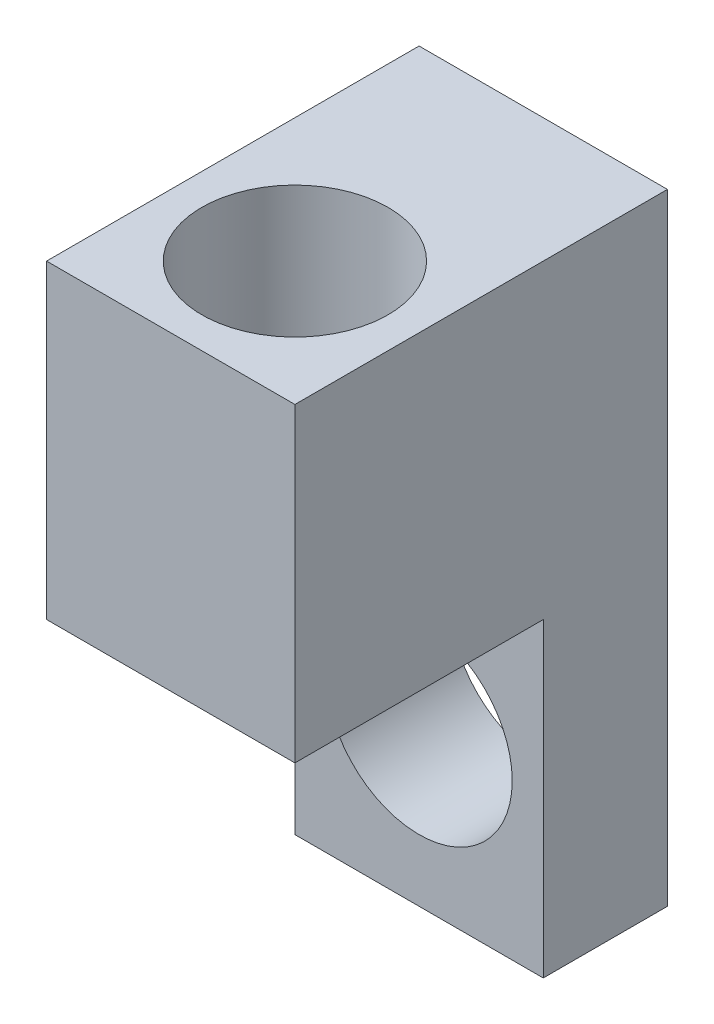
ISO-10303-21;
HEADER;
FILE_DESCRIPTION(('STEP AP214'),'2;1');
FILE_NAME('part.step','',(''),(''),'','','');
FILE_SCHEMA(('AUTOMOTIVE_DESIGN { 1 0 10303 214 1 1 1 1 }'));
ENDSEC;
DATA;
#1=APPLICATION_CONTEXT('core data for automotive mechanical design processes');
#2=APPLICATION_PROTOCOL_DEFINITION('international standard','automotive_design',2000,#1);
#3=PRODUCT_CONTEXT('',#1,'mechanical');
#4=PRODUCT('Part','Part','',(#3));
#5=PRODUCT_RELATED_PRODUCT_CATEGORY('part','',(#4));
#6=PRODUCT_DEFINITION_FORMATION('','',#4);
#7=PRODUCT_DEFINITION_CONTEXT('part definition',#1,'design');
#8=PRODUCT_DEFINITION('design','',#6,#7);
#9=PRODUCT_DEFINITION_SHAPE('','',#8);
#10=(LENGTH_UNIT() NAMED_UNIT(*) SI_UNIT(.MILLI.,.METRE.));
#11=(NAMED_UNIT(*) PLANE_ANGLE_UNIT() SI_UNIT($,.RADIAN.));
#12=(NAMED_UNIT(*) SI_UNIT($,.STERADIAN.) SOLID_ANGLE_UNIT());
#13=UNCERTAINTY_MEASURE_WITH_UNIT(LENGTH_MEASURE(1.E-05),#10,'distance_accuracy_value','');
#14=(GEOMETRIC_REPRESENTATION_CONTEXT(3) GLOBAL_UNCERTAINTY_ASSIGNED_CONTEXT((#13)) GLOBAL_UNIT_ASSIGNED_CONTEXT((#10,
#11,#12)) REPRESENTATION_CONTEXT('',''));
#15=CARTESIAN_POINT('',(0.,0.,0.));
#16=DIRECTION('',(0.,0.,1.));
#17=DIRECTION('',(1.,0.,0.));
#18=AXIS2_PLACEMENT_3D('',#15,#16,#17);
#19=CARTESIAN_POINT('',(4.,-10.,12.));
#20=DIRECTION('',(-1.,0.,0.));
#21=DIRECTION('',(0.,0.,1.));
#22=AXIS2_PLACEMENT_3D('',#19,#20,#21);
#23=PLANE('',#22);
#24=DIRECTION('',(0.,0.,1.));
#25=VECTOR('',#24,1.);
#26=CARTESIAN_POINT('',(4.,0.,12.));
#27=LINE('',#26,#25);
#28=CARTESIAN_POINT('',(4.,0.,4.));
#29=VERTEX_POINT('',#28);
#30=CARTESIAN_POINT('',(4.,0.,12.));
#31=VERTEX_POINT('',#30);
#32=EDGE_CURVE('E47',#29,#31,#27,.T.);
#33=ORIENTED_EDGE('',*,*,#32,.F.);
#34=DIRECTION('',(0.,1.,0.));
#35=VECTOR('',#34,1.);
#36=CARTESIAN_POINT('',(4.,-10.,4.));
#37=LINE('',#36,#35);
#38=CARTESIAN_POINT('',(4.,-10.,4.));
#39=VERTEX_POINT('',#38);
#40=EDGE_CURVE('E82',#39,#29,#37,.T.);
#41=ORIENTED_EDGE('',*,*,#40,.F.);
#42=DIRECTION('',(0.,0.,-1.));
#43=VECTOR('',#42,1.);
#44=CARTESIAN_POINT('',(4.,-10.,12.));
#45=LINE('',#44,#43);
#46=CARTESIAN_POINT('',(4.,-10.,0.));
#47=VERTEX_POINT('',#46);
#48=EDGE_CURVE('E76',#39,#47,#45,.T.);
#49=ORIENTED_EDGE('',*,*,#48,.T.);
#50=DIRECTION('',(0.,1.,0.));
#51=VECTOR('',#50,1.);
#52=CARTESIAN_POINT('',(4.,-10.,0.));
#53=LINE('',#52,#51);
#54=CARTESIAN_POINT('',(4.,10.,0.));
#55=VERTEX_POINT('',#54);
#56=EDGE_CURVE('E80',#47,#55,#53,.T.);
#57=ORIENTED_EDGE('',*,*,#56,.T.);
#58=DIRECTION('',(0.,0.,-1.));
#59=VECTOR('',#58,1.);
#60=CARTESIAN_POINT('',(4.,10.,12.));
#61=LINE('',#60,#59);
#62=CARTESIAN_POINT('',(4.,10.,12.));
#63=VERTEX_POINT('',#62);
#64=EDGE_CURVE('E11',#63,#55,#61,.T.);
#65=ORIENTED_EDGE('',*,*,#64,.F.);
#66=DIRECTION('',(0.,1.,0.));
#67=VECTOR('',#66,1.);
#68=CARTESIAN_POINT('',(4.,-10.,12.));
#69=LINE('',#68,#67);
#70=EDGE_CURVE('E95',#31,#63,#69,.T.);
#71=ORIENTED_EDGE('',*,*,#70,.F.);
#72=EDGE_LOOP('',(#33,#41,#49,#57,#65,#71));
#73=FACE_BOUND('',#72,.T.);
#74=ADVANCED_FACE('F33',(#73),#23,.F.);
#75=CARTESIAN_POINT('',(-4.,10.,12.));
#76=DIRECTION('',(0.,-1.,0.));
#77=DIRECTION('',(0.,0.,-1.));
#78=AXIS2_PLACEMENT_3D('',#75,#76,#77);
#79=PLANE('',#78);
#80=CARTESIAN_POINT('',(0.,10.,8.));
#81=DIRECTION('',(0.,-1.,0.));
#82=DIRECTION('',(0.,0.,-1.));
#83=AXIS2_PLACEMENT_3D('',#80,#81,#82);
#84=CIRCLE('',#83,3.);
#85=CARTESIAN_POINT('',(0.,10.,5.));
#86=VERTEX_POINT('',#85);
#87=EDGE_CURVE('E131',#86,#86,#84,.F.);
#88=ORIENTED_EDGE('',*,*,#87,.F.);
#89=EDGE_LOOP('',(#88));
#90=FACE_BOUND('',#89,.T.);
#91=DIRECTION('',(-1.,0.,0.));
#92=VECTOR('',#91,1.);
#93=CARTESIAN_POINT('',(-4.,10.,0.));
#94=LINE('',#93,#92);
#95=CARTESIAN_POINT('',(-4.,10.,0.));
#96=VERTEX_POINT('',#95);
#97=EDGE_CURVE('E99',#55,#96,#94,.T.);
#98=ORIENTED_EDGE('',*,*,#97,.T.);
#99=DIRECTION('',(0.,0.,-1.));
#100=VECTOR('',#99,1.);
#101=CARTESIAN_POINT('',(-4.,10.,12.));
#102=LINE('',#101,#100);
#103=CARTESIAN_POINT('',(-4.,10.,12.));
#104=VERTEX_POINT('',#103);
#105=EDGE_CURVE('E40',#104,#96,#102,.T.);
#106=ORIENTED_EDGE('',*,*,#105,.F.);
#107=DIRECTION('',(-1.,0.,0.));
#108=VECTOR('',#107,1.);
#109=CARTESIAN_POINT('',(-4.,10.,12.));
#110=LINE('',#109,#108);
#111=EDGE_CURVE('E56',#63,#104,#110,.T.);
#112=ORIENTED_EDGE('',*,*,#111,.F.);
#113=ORIENTED_EDGE('',*,*,#64,.T.);
#114=EDGE_LOOP('',(#98,#106,#112,#113));
#115=FACE_BOUND('',#114,.T.);
#116=ADVANCED_FACE('F113',(#90,#115),#79,.F.);
#117=CARTESIAN_POINT('',(-4.,-10.,12.));
#118=DIRECTION('',(1.,0.,0.));
#119=DIRECTION('',(0.,0.,-1.));
#120=AXIS2_PLACEMENT_3D('',#117,#118,#119);
#121=PLANE('',#120);
#122=DIRECTION('',(0.,0.,-1.));
#123=VECTOR('',#122,1.);
#124=CARTESIAN_POINT('',(-4.,-10.,12.));
#125=LINE('',#124,#123);
#126=CARTESIAN_POINT('',(-4.,-10.,4.));
#127=VERTEX_POINT('',#126);
#128=CARTESIAN_POINT('',(-4.,-10.,0.));
#129=VERTEX_POINT('',#128);
#130=EDGE_CURVE('E85',#127,#129,#125,.T.);
#131=ORIENTED_EDGE('',*,*,#130,.F.);
#132=DIRECTION('',(0.,-1.,0.));
#133=VECTOR('',#132,1.);
#134=CARTESIAN_POINT('',(-4.,-10.,4.));
#135=LINE('',#134,#133);
#136=CARTESIAN_POINT('',(-4.,0.,4.));
#137=VERTEX_POINT('',#136);
#138=EDGE_CURVE('E121',#137,#127,#135,.T.);
#139=ORIENTED_EDGE('',*,*,#138,.F.);
#140=DIRECTION('',(0.,0.,-1.));
#141=VECTOR('',#140,1.);
#142=CARTESIAN_POINT('',(-4.,0.,12.));
#143=LINE('',#142,#141);
#144=CARTESIAN_POINT('',(-4.,0.,12.));
#145=VERTEX_POINT('',#144);
#146=EDGE_CURVE('E128',#145,#137,#143,.T.);
#147=ORIENTED_EDGE('',*,*,#146,.F.);
#148=DIRECTION('',(0.,-1.,0.));
#149=VECTOR('',#148,1.);
#150=CARTESIAN_POINT('',(-4.,-10.,12.));
#151=LINE('',#150,#149);
#152=EDGE_CURVE('E86',#104,#145,#151,.T.);
#153=ORIENTED_EDGE('',*,*,#152,.F.);
#154=ORIENTED_EDGE('',*,*,#105,.T.);
#155=DIRECTION('',(0.,-1.,0.));
#156=VECTOR('',#155,1.);
#157=CARTESIAN_POINT('',(-4.,-10.,0.));
#158=LINE('',#157,#156);
#159=EDGE_CURVE('E96',#96,#129,#158,.T.);
#160=ORIENTED_EDGE('',*,*,#159,.T.);
#161=EDGE_LOOP('',(#131,#139,#147,#153,#154,#160));
#162=FACE_BOUND('',#161,.T.);
#163=ADVANCED_FACE('F110',(#162),#121,.F.);
#164=CARTESIAN_POINT('',(-4.,-10.,12.));
#165=DIRECTION('',(0.,1.,0.));
#166=DIRECTION('',(0.,0.,1.));
#167=AXIS2_PLACEMENT_3D('',#164,#165,#166);
#168=PLANE('',#167);
#169=ORIENTED_EDGE('',*,*,#48,.F.);
#170=DIRECTION('',(-1.,0.,0.));
#171=VECTOR('',#170,1.);
#172=CARTESIAN_POINT('',(16.8062484748657,-10.,4.));
#173=LINE('',#172,#171);
#174=EDGE_CURVE('E124',#39,#127,#173,.T.);
#175=ORIENTED_EDGE('',*,*,#174,.T.);
#176=ORIENTED_EDGE('',*,*,#130,.T.);
#177=DIRECTION('',(1.,0.,0.));
#178=VECTOR('',#177,1.);
#179=CARTESIAN_POINT('',(-4.,-10.,0.));
#180=LINE('',#179,#178);
#181=EDGE_CURVE('E89',#129,#47,#180,.T.);
#182=ORIENTED_EDGE('',*,*,#181,.T.);
#183=EDGE_LOOP('',(#169,#175,#176,#182));
#184=FACE_BOUND('',#183,.T.);
#185=ADVANCED_FACE('F90',(#184),#168,.F.);
#186=CARTESIAN_POINT('',(0.,0.,12.));
#187=DIRECTION('',(0.,0.,-1.));
#188=DIRECTION('',(-1.,0.,0.));
#189=AXIS2_PLACEMENT_3D('',#186,#187,#188);
#190=PLANE('',#189);
#191=ORIENTED_EDGE('',*,*,#152,.T.);
#192=DIRECTION('',(-1.,0.,0.));
#193=VECTOR('',#192,1.);
#194=CARTESIAN_POINT('',(16.8062484748657,0.,12.));
#195=LINE('',#194,#193);
#196=EDGE_CURVE('E118',#31,#145,#195,.T.);
#197=ORIENTED_EDGE('',*,*,#196,.F.);
#198=ORIENTED_EDGE('',*,*,#70,.T.);
#199=ORIENTED_EDGE('',*,*,#111,.T.);
#200=EDGE_LOOP('',(#191,#197,#198,#199));
#201=FACE_BOUND('',#200,.T.);
#202=ADVANCED_FACE('F162',(#201),#190,.F.);
#203=CARTESIAN_POINT('',(0.,0.,0.));
#204=DIRECTION('',(0.,0.,-1.));
#205=DIRECTION('',(-1.,0.,0.));
#206=AXIS2_PLACEMENT_3D('',#203,#204,#205);
#207=PLANE('',#206);
#208=CARTESIAN_POINT('',(0.,-5.,0.));
#209=DIRECTION('',(0.,0.,-1.));
#210=DIRECTION('',(-1.,0.,0.));
#211=AXIS2_PLACEMENT_3D('',#208,#209,#210);
#212=CIRCLE('',#211,3.);
#213=CARTESIAN_POINT('',(-3.,-5.,0.));
#214=VERTEX_POINT('',#213);
#215=EDGE_CURVE('E138',#214,#214,#212,.F.);
#216=ORIENTED_EDGE('',*,*,#215,.T.);
#217=EDGE_LOOP('',(#216));
#218=FACE_BOUND('',#217,.T.);
#219=ORIENTED_EDGE('',*,*,#56,.F.);
#220=ORIENTED_EDGE('',*,*,#181,.F.);
#221=ORIENTED_EDGE('',*,*,#159,.F.);
#222=ORIENTED_EDGE('',*,*,#97,.F.);
#223=EDGE_LOOP('',(#219,#220,#221,#222));
#224=FACE_BOUND('',#223,.T.);
#225=ADVANCED_FACE('F98',(#218,#224),#207,.T.);
#226=CARTESIAN_POINT('',(16.8062484748657,-10.,4.));
#227=DIRECTION('',(0.,0.,-1.));
#228=DIRECTION('',(-1.,0.,0.));
#229=AXIS2_PLACEMENT_3D('',#226,#227,#228);
#230=PLANE('',#229);
#231=CARTESIAN_POINT('',(0.,-5.,4.));
#232=DIRECTION('',(0.,0.,1.));
#233=DIRECTION('',(1.,0.,0.));
#234=AXIS2_PLACEMENT_3D('',#231,#232,#233);
#235=CIRCLE('',#234,3.);
#236=CARTESIAN_POINT('',(3.,-5.,4.));
#237=VERTEX_POINT('',#236);
#238=EDGE_CURVE('E141',#237,#237,#235,.T.);
#239=ORIENTED_EDGE('',*,*,#238,.F.);
#240=EDGE_LOOP('',(#239));
#241=FACE_BOUND('',#240,.T.);
#242=ORIENTED_EDGE('',*,*,#40,.T.);
#243=DIRECTION('',(-1.,0.,0.));
#244=VECTOR('',#243,1.);
#245=CARTESIAN_POINT('',(16.8062484748657,0.,4.));
#246=LINE('',#245,#244);
#247=EDGE_CURVE('E120',#29,#137,#246,.T.);
#248=ORIENTED_EDGE('',*,*,#247,.T.);
#249=ORIENTED_EDGE('',*,*,#138,.T.);
#250=ORIENTED_EDGE('',*,*,#174,.F.);
#251=EDGE_LOOP('',(#242,#248,#249,#250));
#252=FACE_BOUND('',#251,.T.);
#253=ADVANCED_FACE('F148',(#241,#252),#230,.F.);
#254=CARTESIAN_POINT('',(16.8062484748657,0.,12.));
#255=DIRECTION('',(0.,1.,0.));
#256=DIRECTION('',(0.,0.,1.));
#257=AXIS2_PLACEMENT_3D('',#254,#255,#256);
#258=PLANE('',#257);
#259=CARTESIAN_POINT('',(0.,0.,8.));
#260=DIRECTION('',(0.,-1.,0.));
#261=DIRECTION('',(0.,0.,-1.));
#262=AXIS2_PLACEMENT_3D('',#259,#260,#261);
#263=CIRCLE('',#262,3.);
#264=CARTESIAN_POINT('',(0.,0.,5.));
#265=VERTEX_POINT('',#264);
#266=EDGE_CURVE('E135',#265,#265,#263,.T.);
#267=ORIENTED_EDGE('',*,*,#266,.F.);
#268=EDGE_LOOP('',(#267));
#269=FACE_BOUND('',#268,.T.);
#270=ORIENTED_EDGE('',*,*,#32,.T.);
#271=ORIENTED_EDGE('',*,*,#196,.T.);
#272=ORIENTED_EDGE('',*,*,#146,.T.);
#273=ORIENTED_EDGE('',*,*,#247,.F.);
#274=EDGE_LOOP('',(#270,#271,#272,#273));
#275=FACE_BOUND('',#274,.T.);
#276=ADVANCED_FACE('F151',(#269,#275),#258,.F.);
#277=CARTESIAN_POINT('',(0.,18.4852813742386,8.));
#278=DIRECTION('',(0.,-1.,0.));
#279=DIRECTION('',(0.,0.,-1.));
#280=AXIS2_PLACEMENT_3D('',#277,#278,#279);
#281=CYLINDRICAL_SURFACE('',#280,3.);
#282=ORIENTED_EDGE('',*,*,#87,.T.);
#283=EDGE_LOOP('',(#282));
#284=FACE_BOUND('',#283,.T.);
#285=ORIENTED_EDGE('',*,*,#266,.T.);
#286=EDGE_LOOP('',(#285));
#287=FACE_BOUND('',#286,.T.);
#288=ADVANCED_FACE('F184',(#284,#287),#281,.F.);
#289=CARTESIAN_POINT('',(0.,-5.,-8.48528137423857));
#290=DIRECTION('',(0.,0.,1.));
#291=DIRECTION('',(1.,0.,0.));
#292=AXIS2_PLACEMENT_3D('',#289,#290,#291);
#293=CYLINDRICAL_SURFACE('',#292,3.);
#294=ORIENTED_EDGE('',*,*,#238,.T.);
#295=EDGE_LOOP('',(#294));
#296=FACE_BOUND('',#295,.T.);
#297=ORIENTED_EDGE('',*,*,#215,.F.);
#298=EDGE_LOOP('',(#297));
#299=FACE_BOUND('',#298,.T.);
#300=ADVANCED_FACE('F145',(#296,#299),#293,.F.);
#301=CLOSED_SHELL('',(#74,#116,#163,#185,#202,#225,#253,#276,#288,#300));
#302=MANIFOLD_SOLID_BREP('B2',#301);
#303=ADVANCED_BREP_SHAPE_REPRESENTATION('',(#18,#302),#14);
#304=SHAPE_DEFINITION_REPRESENTATION(#9,#303);
ENDSEC;
END-ISO-10303-21;
